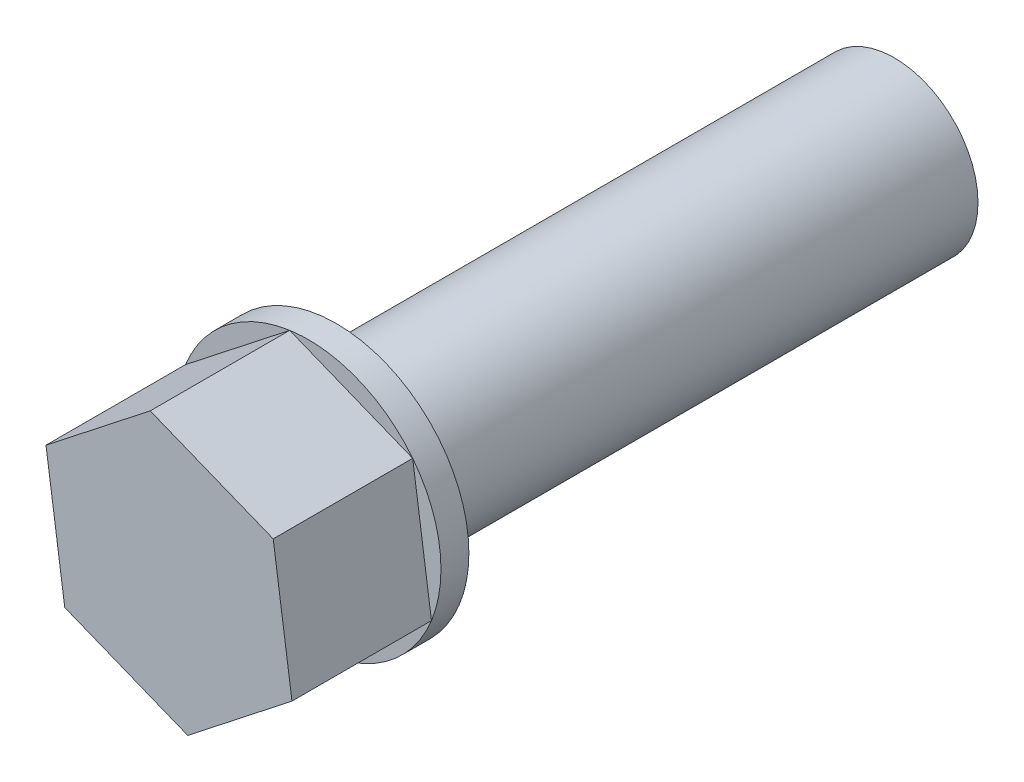
ISO-10303-21;
HEADER;
FILE_DESCRIPTION(('STEP AP214'),'2;1');
FILE_NAME('part.step','',(''),(''),'','','');
FILE_SCHEMA(('AUTOMOTIVE_DESIGN { 1 0 10303 214 1 1 1 1 }'));
ENDSEC;
DATA;
#1=APPLICATION_CONTEXT('core data for automotive mechanical design processes');
#2=APPLICATION_PROTOCOL_DEFINITION('international standard','automotive_design',2000,#1);
#3=PRODUCT_CONTEXT('',#1,'mechanical');
#4=PRODUCT('Part','Part','',(#3));
#5=PRODUCT_RELATED_PRODUCT_CATEGORY('part','',(#4));
#6=PRODUCT_DEFINITION_FORMATION('','',#4);
#7=PRODUCT_DEFINITION_CONTEXT('part definition',#1,'design');
#8=PRODUCT_DEFINITION('design','',#6,#7);
#9=PRODUCT_DEFINITION_SHAPE('','',#8);
#10=(LENGTH_UNIT() NAMED_UNIT(*) SI_UNIT(.MILLI.,.METRE.));
#11=(NAMED_UNIT(*) PLANE_ANGLE_UNIT() SI_UNIT($,.RADIAN.));
#12=(NAMED_UNIT(*) SI_UNIT($,.STERADIAN.) SOLID_ANGLE_UNIT());
#13=UNCERTAINTY_MEASURE_WITH_UNIT(LENGTH_MEASURE(1.E-05),#10,'distance_accuracy_value','');
#14=(GEOMETRIC_REPRESENTATION_CONTEXT(3) GLOBAL_UNCERTAINTY_ASSIGNED_CONTEXT((#13)) GLOBAL_UNIT_ASSIGNED_CONTEXT((#10,
#11,#12)) REPRESENTATION_CONTEXT('',''));
#15=CARTESIAN_POINT('',(0.,0.,0.));
#16=DIRECTION('',(0.,0.,1.));
#17=DIRECTION('',(1.,0.,0.));
#18=AXIS2_PLACEMENT_3D('',#15,#16,#17);
#19=CARTESIAN_POINT('',(0.,0.,42.));
#20=DIRECTION('',(0.,0.,1.));
#21=DIRECTION('',(1.,0.,0.));
#22=AXIS2_PLACEMENT_3D('',#19,#20,#21);
#23=PLANE('',#22);
#24=DIRECTION('',(-0.928082184458144,0.37237542734638,0.));
#25=VECTOR('',#24,1.);
#26=CARTESIAN_POINT('',(7.47201288453317,5.86677283123952,42.));
#27=LINE('',#26,#25);
#28=CARTESIAN_POINT('',(7.47201288453316,5.86677283123954,42.));
#29=VERTEX_POINT('',#28);
#30=CARTESIAN_POINT('',(-1.34476786781918,9.40433939103014,42.));
#31=VERTEX_POINT('',#30);
#32=EDGE_CURVE('E111',#29,#31,#27,.T.);
#33=ORIENTED_EDGE('',*,*,#32,.F.);
#34=CARTESIAN_POINT('',(0.,0.,42.));
#35=DIRECTION('',(0.,0.,1.));
#36=DIRECTION('',(1.,0.,0.));
#37=AXIS2_PLACEMENT_3D('',#34,#35,#36);
#38=CIRCLE('',#37,9.5);
#39=EDGE_CURVE('E121',#29,#31,#38,.T.);
#40=ORIENTED_EDGE('',*,*,#39,.T.);
#41=EDGE_LOOP('',(#33,#40));
#42=FACE_BOUND('',#41,.T.);
#43=ADVANCED_FACE('F33',(#42),#23,.T.);
#44=DIRECTION('',(-0.141554512402021,0.989930462213698,0.));
#45=VECTOR('',#44,1.);
#46=CARTESIAN_POINT('',(8.81678075235237,-3.5375665597906,42.));
#47=LINE('',#46,#45);
#48=CARTESIAN_POINT('',(8.81678075235237,-3.53756655979059,42.));
#49=VERTEX_POINT('',#48);
#50=EDGE_CURVE('E47',#49,#29,#47,.T.);
#51=ORIENTED_EDGE('',*,*,#50,.F.);
#52=EDGE_CURVE('E115',#49,#29,#38,.T.);
#53=ORIENTED_EDGE('',*,*,#52,.T.);
#54=EDGE_LOOP('',(#51,#53));
#55=FACE_BOUND('',#54,.T.);
#56=ADVANCED_FACE('F188',(#55),#23,.T.);
#57=DIRECTION('',(0.786527672056124,0.617555034867318,0.));
#58=VECTOR('',#57,1.);
#59=CARTESIAN_POINT('',(1.34476786781919,-9.40433939103012,42.));
#60=LINE('',#59,#58);
#61=CARTESIAN_POINT('',(1.34476786781922,-9.40433939103013,42.));
#62=VERTEX_POINT('',#61);
#63=EDGE_CURVE('E54',#62,#49,#60,.T.);
#64=ORIENTED_EDGE('',*,*,#63,.F.);
#65=EDGE_CURVE('E128',#62,#49,#38,.T.);
#66=ORIENTED_EDGE('',*,*,#65,.T.);
#67=EDGE_LOOP('',(#64,#66));
#68=FACE_BOUND('',#67,.T.);
#69=ADVANCED_FACE('F194',(#68),#23,.T.);
#70=DIRECTION('',(0.928082184458145,-0.372375427346379,0.));
#71=VECTOR('',#70,1.);
#72=CARTESIAN_POINT('',(-7.47201288453317,-5.86677283123952,42.));
#73=LINE('',#72,#71);
#74=CARTESIAN_POINT('',(-7.47201288453317,-5.86677283123953,42.));
#75=VERTEX_POINT('',#74);
#76=EDGE_CURVE('E148',#75,#62,#73,.T.);
#77=ORIENTED_EDGE('',*,*,#76,.F.);
#78=EDGE_CURVE('E129',#75,#62,#38,.T.);
#79=ORIENTED_EDGE('',*,*,#78,.T.);
#80=EDGE_LOOP('',(#77,#79));
#81=FACE_BOUND('',#80,.T.);
#82=ADVANCED_FACE('F209',(#81),#23,.T.);
#83=DIRECTION('',(0.141554512402021,-0.989930462213698,0.));
#84=VECTOR('',#83,1.);
#85=CARTESIAN_POINT('',(-8.81678075235237,3.5375665597906,42.));
#86=LINE('',#85,#84);
#87=CARTESIAN_POINT('',(-8.81678075235237,3.5375665597906,42.));
#88=VERTEX_POINT('',#87);
#89=EDGE_CURVE('E140',#88,#75,#86,.T.);
#90=ORIENTED_EDGE('',*,*,#89,.F.);
#91=EDGE_CURVE('E127',#88,#75,#38,.T.);
#92=ORIENTED_EDGE('',*,*,#91,.T.);
#93=EDGE_LOOP('',(#90,#92));
#94=FACE_BOUND('',#93,.T.);
#95=ADVANCED_FACE('F139',(#94),#23,.T.);
#96=CARTESIAN_POINT('',(0.,0.,40.));
#97=DIRECTION('',(0.,0.,-1.));
#98=DIRECTION('',(-1.,0.,0.));
#99=AXIS2_PLACEMENT_3D('',#96,#97,#98);
#100=CYLINDRICAL_SURFACE('',#99,6.);
#101=CARTESIAN_POINT('',(0.,0.,40.));
#102=DIRECTION('',(0.,0.,1.));
#103=DIRECTION('',(1.,0.,0.));
#104=AXIS2_PLACEMENT_3D('',#101,#102,#103);
#105=CIRCLE('',#104,6.);
#106=CARTESIAN_POINT('',(6.,0.,40.));
#107=VERTEX_POINT('',#106);
#108=EDGE_CURVE('E11',#107,#107,#105,.T.);
#109=ORIENTED_EDGE('',*,*,#108,.F.);
#110=EDGE_LOOP('',(#109));
#111=FACE_BOUND('',#110,.T.);
#112=CARTESIAN_POINT('',(0.,0.,0.));
#113=DIRECTION('',(0.,0.,1.));
#114=DIRECTION('',(1.,0.,0.));
#115=AXIS2_PLACEMENT_3D('',#112,#113,#114);
#116=CIRCLE('',#115,6.);
#117=CARTESIAN_POINT('',(6.,0.,0.));
#118=VERTEX_POINT('',#117);
#119=EDGE_CURVE('E37',#118,#118,#116,.T.);
#120=ORIENTED_EDGE('',*,*,#119,.T.);
#121=EDGE_LOOP('',(#120));
#122=FACE_BOUND('',#121,.T.);
#123=ADVANCED_FACE('F35',(#111,#122),#100,.T.);
#124=CARTESIAN_POINT('',(0.,0.,0.));
#125=DIRECTION('',(0.,0.,1.));
#126=DIRECTION('',(1.,0.,0.));
#127=AXIS2_PLACEMENT_3D('',#124,#125,#126);
#128=PLANE('',#127);
#129=ORIENTED_EDGE('',*,*,#119,.F.);
#130=EDGE_LOOP('',(#129));
#131=FACE_BOUND('',#130,.T.);
#132=ADVANCED_FACE('F206',(#131),#128,.F.);
#133=CARTESIAN_POINT('',(0.,0.,42.));
#134=DIRECTION('',(0.,0.,-1.));
#135=DIRECTION('',(-1.,0.,0.));
#136=AXIS2_PLACEMENT_3D('',#133,#134,#135);
#137=CYLINDRICAL_SURFACE('',#136,9.5);
#138=ORIENTED_EDGE('',*,*,#39,.F.);
#139=ORIENTED_EDGE('',*,*,#52,.F.);
#140=ORIENTED_EDGE('',*,*,#65,.F.);
#141=ORIENTED_EDGE('',*,*,#78,.F.);
#142=ORIENTED_EDGE('',*,*,#91,.F.);
#143=EDGE_CURVE('E123',#31,#88,#38,.T.);
#144=ORIENTED_EDGE('',*,*,#143,.F.);
#145=EDGE_LOOP('',(#138,#139,#140,#141,#142,#144));
#146=FACE_BOUND('',#145,.T.);
#147=CARTESIAN_POINT('',(0.,0.,40.));
#148=DIRECTION('',(0.,0.,1.));
#149=DIRECTION('',(1.,0.,0.));
#150=AXIS2_PLACEMENT_3D('',#147,#148,#149);
#151=CIRCLE('',#150,9.5);
#152=CARTESIAN_POINT('',(9.5,0.,40.));
#153=VERTEX_POINT('',#152);
#154=EDGE_CURVE('E112',#153,#153,#151,.T.);
#155=ORIENTED_EDGE('',*,*,#154,.T.);
#156=EDGE_LOOP('',(#155));
#157=FACE_BOUND('',#156,.T.);
#158=ADVANCED_FACE('F199',(#146,#157),#137,.T.);
#159=DIRECTION('',(-0.786527672056124,-0.617555034867318,0.));
#160=VECTOR('',#159,1.);
#161=CARTESIAN_POINT('',(-1.34476786781919,9.40433939103012,42.));
#162=LINE('',#161,#160);
#163=EDGE_CURVE('E149',#31,#88,#162,.T.);
#164=ORIENTED_EDGE('',*,*,#163,.F.);
#165=ORIENTED_EDGE('',*,*,#143,.T.);
#166=EDGE_LOOP('',(#164,#165));
#167=FACE_BOUND('',#166,.T.);
#168=ADVANCED_FACE('F190',(#167),#23,.T.);
#169=CARTESIAN_POINT('',(0.,0.,40.));
#170=DIRECTION('',(0.,0.,1.));
#171=DIRECTION('',(1.,0.,0.));
#172=AXIS2_PLACEMENT_3D('',#169,#170,#171);
#173=PLANE('',#172);
#174=ORIENTED_EDGE('',*,*,#108,.T.);
#175=EDGE_LOOP('',(#174));
#176=FACE_BOUND('',#175,.T.);
#177=ORIENTED_EDGE('',*,*,#154,.F.);
#178=EDGE_LOOP('',(#177));
#179=FACE_BOUND('',#178,.T.);
#180=ADVANCED_FACE('F198',(#176,#179),#173,.F.);
#181=CARTESIAN_POINT('',(7.47201288453317,5.86677283123952,52.));
#182=DIRECTION('',(-0.37237542734638,-0.928082184458144,0.));
#183=DIRECTION('',(0.928082184458144,-0.37237542734638,0.));
#184=AXIS2_PLACEMENT_3D('',#181,#182,#183);
#185=PLANE('',#184);
#186=ORIENTED_EDGE('',*,*,#32,.T.);
#187=DIRECTION('',(0.,0.,-1.));
#188=VECTOR('',#187,1.);
#189=CARTESIAN_POINT('',(-1.34476786781919,9.40433939103012,52.));
#190=LINE('',#189,#188);
#191=CARTESIAN_POINT('',(-1.34476786781919,9.40433939103012,52.));
#192=VERTEX_POINT('',#191);
#193=EDGE_CURVE('E93',#192,#31,#190,.T.);
#194=ORIENTED_EDGE('',*,*,#193,.F.);
#195=DIRECTION('',(-0.928082184458144,0.37237542734638,0.));
#196=VECTOR('',#195,1.);
#197=CARTESIAN_POINT('',(7.47201288453317,5.86677283123952,52.));
#198=LINE('',#197,#196);
#199=CARTESIAN_POINT('',(7.47201288453317,5.86677283123952,52.));
#200=VERTEX_POINT('',#199);
#201=EDGE_CURVE('E100',#200,#192,#198,.T.);
#202=ORIENTED_EDGE('',*,*,#201,.F.);
#203=DIRECTION('',(0.,0.,-1.));
#204=VECTOR('',#203,1.);
#205=CARTESIAN_POINT('',(7.47201288453317,5.86677283123952,52.));
#206=LINE('',#205,#204);
#207=EDGE_CURVE('E162',#200,#29,#206,.T.);
#208=ORIENTED_EDGE('',*,*,#207,.T.);
#209=EDGE_LOOP('',(#186,#194,#202,#208));
#210=FACE_BOUND('',#209,.T.);
#211=ADVANCED_FACE('F110',(#210),#185,.F.);
#212=CARTESIAN_POINT('',(-1.34476786781919,9.40433939103012,52.));
#213=DIRECTION('',(0.617555034867318,-0.786527672056124,0.));
#214=DIRECTION('',(0.786527672056124,0.617555034867318,0.));
#215=AXIS2_PLACEMENT_3D('',#212,#213,#214);
#216=PLANE('',#215);
#217=ORIENTED_EDGE('',*,*,#163,.T.);
#218=DIRECTION('',(0.,0.,-1.));
#219=VECTOR('',#218,1.);
#220=CARTESIAN_POINT('',(-8.81678075235237,3.5375665597906,52.));
#221=LINE('',#220,#219);
#222=CARTESIAN_POINT('',(-8.81678075235237,3.5375665597906,52.));
#223=VERTEX_POINT('',#222);
#224=EDGE_CURVE('E96',#223,#88,#221,.T.);
#225=ORIENTED_EDGE('',*,*,#224,.F.);
#226=DIRECTION('',(-0.786527672056124,-0.617555034867318,0.));
#227=VECTOR('',#226,1.);
#228=CARTESIAN_POINT('',(-1.34476786781919,9.40433939103012,52.));
#229=LINE('',#228,#227);
#230=EDGE_CURVE('E88',#192,#223,#229,.T.);
#231=ORIENTED_EDGE('',*,*,#230,.F.);
#232=ORIENTED_EDGE('',*,*,#193,.T.);
#233=EDGE_LOOP('',(#217,#225,#231,#232));
#234=FACE_BOUND('',#233,.T.);
#235=ADVANCED_FACE('F91',(#234),#216,.F.);
#236=CARTESIAN_POINT('',(-8.81678075235237,3.5375665597906,52.));
#237=DIRECTION('',(0.989930462213698,0.141554512402021,0.));
#238=DIRECTION('',(-0.141554512402021,0.989930462213698,0.));
#239=AXIS2_PLACEMENT_3D('',#236,#237,#238);
#240=PLANE('',#239);
#241=ORIENTED_EDGE('',*,*,#89,.T.);
#242=DIRECTION('',(0.,0.,-1.));
#243=VECTOR('',#242,1.);
#244=CARTESIAN_POINT('',(-7.47201288453317,-5.86677283123952,52.));
#245=LINE('',#244,#243);
#246=CARTESIAN_POINT('',(-7.47201288453317,-5.86677283123952,52.));
#247=VERTEX_POINT('',#246);
#248=EDGE_CURVE('E117',#247,#75,#245,.T.);
#249=ORIENTED_EDGE('',*,*,#248,.F.);
#250=DIRECTION('',(0.141554512402021,-0.989930462213698,0.));
#251=VECTOR('',#250,1.);
#252=CARTESIAN_POINT('',(-8.81678075235237,3.5375665597906,52.));
#253=LINE('',#252,#251);
#254=EDGE_CURVE('E99',#223,#247,#253,.T.);
#255=ORIENTED_EDGE('',*,*,#254,.F.);
#256=ORIENTED_EDGE('',*,*,#224,.T.);
#257=EDGE_LOOP('',(#241,#249,#255,#256));
#258=FACE_BOUND('',#257,.T.);
#259=ADVANCED_FACE('F146',(#258),#240,.F.);
#260=CARTESIAN_POINT('',(-7.47201288453317,-5.86677283123952,52.));
#261=DIRECTION('',(0.372375427346379,0.928082184458145,0.));
#262=DIRECTION('',(-0.928082184458145,0.372375427346379,0.));
#263=AXIS2_PLACEMENT_3D('',#260,#261,#262);
#264=PLANE('',#263);
#265=ORIENTED_EDGE('',*,*,#76,.T.);
#266=DIRECTION('',(0.,0.,-1.));
#267=VECTOR('',#266,1.);
#268=CARTESIAN_POINT('',(1.34476786781919,-9.40433939103012,52.));
#269=LINE('',#268,#267);
#270=CARTESIAN_POINT('',(1.34476786781919,-9.40433939103012,52.));
#271=VERTEX_POINT('',#270);
#272=EDGE_CURVE('E156',#271,#62,#269,.T.);
#273=ORIENTED_EDGE('',*,*,#272,.F.);
#274=DIRECTION('',(0.928082184458145,-0.372375427346379,0.));
#275=VECTOR('',#274,1.);
#276=CARTESIAN_POINT('',(-7.47201288453317,-5.86677283123952,52.));
#277=LINE('',#276,#275);
#278=EDGE_CURVE('E155',#247,#271,#277,.T.);
#279=ORIENTED_EDGE('',*,*,#278,.F.);
#280=ORIENTED_EDGE('',*,*,#248,.T.);
#281=EDGE_LOOP('',(#265,#273,#279,#280));
#282=FACE_BOUND('',#281,.T.);
#283=ADVANCED_FACE('F152',(#282),#264,.F.);
#284=CARTESIAN_POINT('',(1.34476786781919,-9.40433939103012,52.));
#285=DIRECTION('',(-0.617555034867318,0.786527672056124,0.));
#286=DIRECTION('',(-0.786527672056124,-0.617555034867318,0.));
#287=AXIS2_PLACEMENT_3D('',#284,#285,#286);
#288=PLANE('',#287);
#289=ORIENTED_EDGE('',*,*,#63,.T.);
#290=DIRECTION('',(0.,0.,-1.));
#291=VECTOR('',#290,1.);
#292=CARTESIAN_POINT('',(8.81678075235237,-3.5375665597906,52.));
#293=LINE('',#292,#291);
#294=CARTESIAN_POINT('',(8.81678075235237,-3.5375665597906,52.));
#295=VERTEX_POINT('',#294);
#296=EDGE_CURVE('E157',#295,#49,#293,.T.);
#297=ORIENTED_EDGE('',*,*,#296,.F.);
#298=DIRECTION('',(0.786527672056124,0.617555034867318,0.));
#299=VECTOR('',#298,1.);
#300=CARTESIAN_POINT('',(1.34476786781919,-9.40433939103012,52.));
#301=LINE('',#300,#299);
#302=EDGE_CURVE('E170',#271,#295,#301,.T.);
#303=ORIENTED_EDGE('',*,*,#302,.F.);
#304=ORIENTED_EDGE('',*,*,#272,.T.);
#305=EDGE_LOOP('',(#289,#297,#303,#304));
#306=FACE_BOUND('',#305,.T.);
#307=ADVANCED_FACE('F176',(#306),#288,.F.);
#308=CARTESIAN_POINT('',(8.81678075235237,-3.5375665597906,52.));
#309=DIRECTION('',(-0.989930462213698,-0.141554512402021,0.));
#310=DIRECTION('',(0.141554512402021,-0.989930462213698,0.));
#311=AXIS2_PLACEMENT_3D('',#308,#309,#310);
#312=PLANE('',#311);
#313=ORIENTED_EDGE('',*,*,#50,.T.);
#314=ORIENTED_EDGE('',*,*,#207,.F.);
#315=DIRECTION('',(-0.141554512402021,0.989930462213698,0.));
#316=VECTOR('',#315,1.);
#317=CARTESIAN_POINT('',(8.81678075235237,-3.5375665597906,52.));
#318=LINE('',#317,#316);
#319=EDGE_CURVE('E105',#295,#200,#318,.T.);
#320=ORIENTED_EDGE('',*,*,#319,.F.);
#321=ORIENTED_EDGE('',*,*,#296,.T.);
#322=EDGE_LOOP('',(#313,#314,#320,#321));
#323=FACE_BOUND('',#322,.T.);
#324=ADVANCED_FACE('F178',(#323),#312,.F.);
#325=CARTESIAN_POINT('',(0.,0.,52.));
#326=DIRECTION('',(0.,0.,1.));
#327=DIRECTION('',(1.,0.,0.));
#328=AXIS2_PLACEMENT_3D('',#325,#326,#327);
#329=PLANE('',#328);
#330=ORIENTED_EDGE('',*,*,#201,.T.);
#331=ORIENTED_EDGE('',*,*,#230,.T.);
#332=ORIENTED_EDGE('',*,*,#254,.T.);
#333=ORIENTED_EDGE('',*,*,#278,.T.);
#334=ORIENTED_EDGE('',*,*,#302,.T.);
#335=ORIENTED_EDGE('',*,*,#319,.T.);
#336=EDGE_LOOP('',(#330,#331,#332,#333,#334,#335));
#337=FACE_BOUND('',#336,.T.);
#338=ADVANCED_FACE('F103',(#337),#329,.T.);
#339=CLOSED_SHELL('',(#43,#56,#69,#82,#95,#123,#132,#158,#168,#180,#211,#235,#259,#283,#307,
#324,#338));
#340=MANIFOLD_SOLID_BREP('B2',#339);
#341=ADVANCED_BREP_SHAPE_REPRESENTATION('',(#18,#340),#14);
#342=SHAPE_DEFINITION_REPRESENTATION(#9,#341);
ENDSEC;
END-ISO-10303-21;
